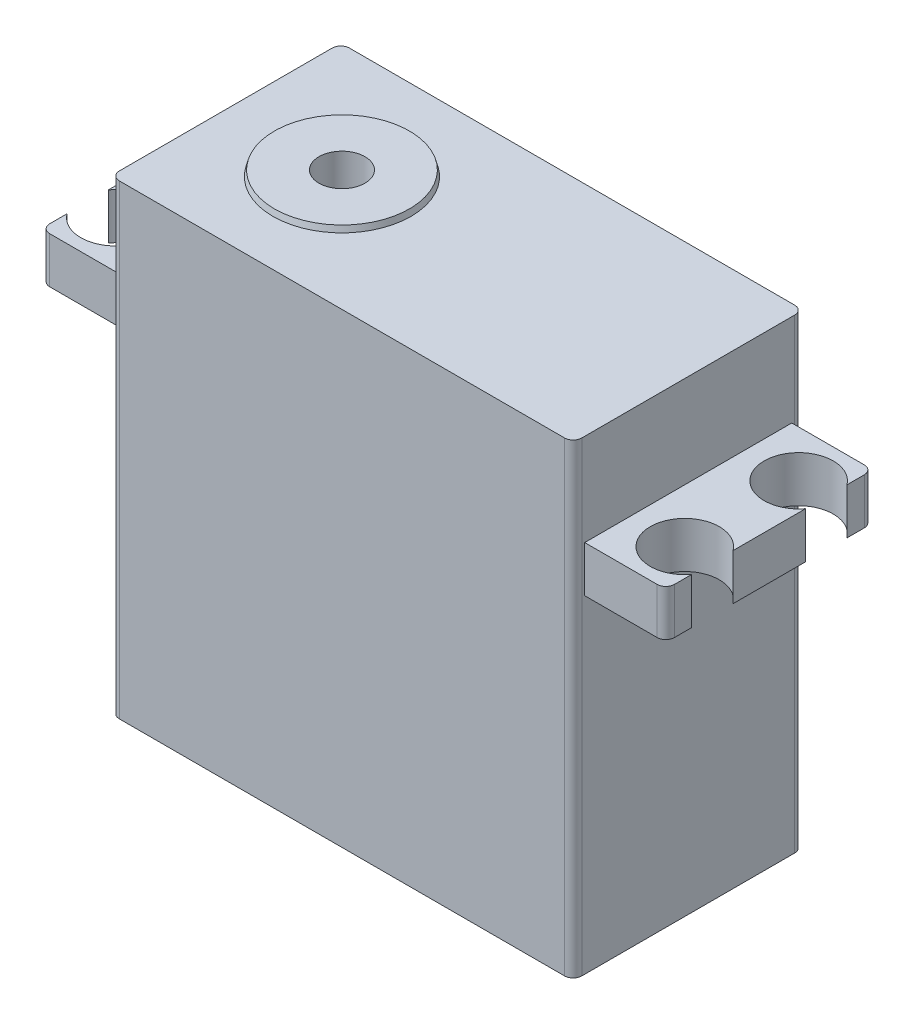
ISO-10303-21;
HEADER;
FILE_DESCRIPTION(('STEP AP214'),'2;1');
FILE_NAME('part.step','',(''),(''),'','','');
FILE_SCHEMA(('AUTOMOTIVE_DESIGN { 1 0 10303 214 1 1 1 1 }'));
ENDSEC;
DATA;
#1=APPLICATION_CONTEXT('core data for automotive mechanical design processes');
#2=APPLICATION_PROTOCOL_DEFINITION('international standard','automotive_design',2000,#1);
#3=PRODUCT_CONTEXT('',#1,'mechanical');
#4=PRODUCT('Part','Part','',(#3));
#5=PRODUCT_RELATED_PRODUCT_CATEGORY('part','',(#4));
#6=PRODUCT_DEFINITION_FORMATION('','',#4);
#7=PRODUCT_DEFINITION_CONTEXT('part definition',#1,'design');
#8=PRODUCT_DEFINITION('design','',#6,#7);
#9=PRODUCT_DEFINITION_SHAPE('','',#8);
#10=(LENGTH_UNIT() NAMED_UNIT(*) SI_UNIT(.MILLI.,.METRE.));
#11=(NAMED_UNIT(*) PLANE_ANGLE_UNIT() SI_UNIT($,.RADIAN.));
#12=(NAMED_UNIT(*) SI_UNIT($,.STERADIAN.) SOLID_ANGLE_UNIT());
#13=UNCERTAINTY_MEASURE_WITH_UNIT(LENGTH_MEASURE(1.E-05),#10,'distance_accuracy_value','');
#14=(GEOMETRIC_REPRESENTATION_CONTEXT(3) GLOBAL_UNCERTAINTY_ASSIGNED_CONTEXT((#13)) GLOBAL_UNIT_ASSIGNED_CONTEXT((#10,
#11,#12)) REPRESENTATION_CONTEXT('',''));
#15=CARTESIAN_POINT('',(0.,0.,0.));
#16=DIRECTION('',(0.,0.,1.));
#17=DIRECTION('',(1.,0.,0.));
#18=AXIS2_PLACEMENT_3D('',#15,#16,#17);
#19=CARTESIAN_POINT('',(-27.15,0.,0.));
#20=DIRECTION('',(1.,0.,0.));
#21=DIRECTION('',(0.,0.,1.));
#22=AXIS2_PLACEMENT_3D('',#19,#20,#21);
#23=PLANE('',#22);
#24=DIRECTION('',(0.,0.,-1.));
#25=VECTOR('',#24,1.);
#26=CARTESIAN_POINT('',(-27.15,32.5,9.));
#27=LINE('',#26,#25);
#28=CARTESIAN_POINT('',(-27.15,32.5,3.15));
#29=VERTEX_POINT('',#28);
#30=CARTESIAN_POINT('',(-27.15,32.5,-3.15));
#31=VERTEX_POINT('',#30);
#32=EDGE_CURVE('E254',#29,#31,#27,.T.);
#33=ORIENTED_EDGE('',*,*,#32,.T.);
#34=DIRECTION('',(0.,1.,0.));
#35=VECTOR('',#34,1.);
#36=CARTESIAN_POINT('',(-27.15,23.45,-3.15));
#37=LINE('',#36,#35);
#38=CARTESIAN_POINT('',(-27.15,28.5,-3.15));
#39=VERTEX_POINT('',#38);
#40=EDGE_CURVE('E239',#39,#31,#37,.T.);
#41=ORIENTED_EDGE('',*,*,#40,.F.);
#42=DIRECTION('',(0.,0.,-1.));
#43=VECTOR('',#42,1.);
#44=CARTESIAN_POINT('',(-27.15,28.5,9.));
#45=LINE('',#44,#43);
#46=CARTESIAN_POINT('',(-27.15,28.5,3.15));
#47=VERTEX_POINT('',#46);
#48=EDGE_CURVE('E290',#47,#39,#45,.T.);
#49=ORIENTED_EDGE('',*,*,#48,.F.);
#50=DIRECTION('',(0.,1.,0.));
#51=VECTOR('',#50,1.);
#52=CARTESIAN_POINT('',(-27.15,23.45,3.15));
#53=LINE('',#52,#51);
#54=EDGE_CURVE('E361',#29,#47,#53,.F.);
#55=ORIENTED_EDGE('',*,*,#54,.F.);
#56=EDGE_LOOP('',(#33,#41,#49,#55));
#57=FACE_BOUND('',#56,.T.);
#58=ADVANCED_FACE('F43',(#57),#23,.F.);
#59=CARTESIAN_POINT('',(-27.15,28.5,8.25));
#60=VERTEX_POINT('',#59);
#61=CARTESIAN_POINT('',(-27.15,28.5,6.75));
#62=VERTEX_POINT('',#61);
#63=EDGE_CURVE('E287',#60,#62,#45,.T.);
#64=ORIENTED_EDGE('',*,*,#63,.F.);
#65=DIRECTION('',(0.,-1.,0.));
#66=VECTOR('',#65,1.);
#67=CARTESIAN_POINT('',(-27.15,32.5,8.25));
#68=LINE('',#67,#66);
#69=CARTESIAN_POINT('',(-27.15,32.5,8.25));
#70=VERTEX_POINT('',#69);
#71=EDGE_CURVE('E409',#60,#70,#68,.F.);
#72=ORIENTED_EDGE('',*,*,#71,.T.);
#73=CARTESIAN_POINT('',(-27.15,32.5,6.75));
#74=VERTEX_POINT('',#73);
#75=EDGE_CURVE('E257',#70,#74,#27,.T.);
#76=ORIENTED_EDGE('',*,*,#75,.T.);
#77=DIRECTION('',(0.,1.,0.));
#78=VECTOR('',#77,1.);
#79=CARTESIAN_POINT('',(-27.15,23.45,6.75));
#80=LINE('',#79,#78);
#81=EDGE_CURVE('E359',#62,#74,#80,.T.);
#82=ORIENTED_EDGE('',*,*,#81,.F.);
#83=EDGE_LOOP('',(#64,#72,#76,#82));
#84=FACE_BOUND('',#83,.T.);
#85=ADVANCED_FACE('F529',(#84),#23,.F.);
#86=CARTESIAN_POINT('',(27.15,0.,0.));
#87=DIRECTION('',(-1.,0.,0.));
#88=DIRECTION('',(0.,0.,1.));
#89=AXIS2_PLACEMENT_3D('',#86,#87,#88);
#90=PLANE('',#89);
#91=DIRECTION('',(0.,0.,-1.));
#92=VECTOR('',#91,1.);
#93=CARTESIAN_POINT('',(27.15,28.5,9.));
#94=LINE('',#93,#92);
#95=CARTESIAN_POINT('',(27.15,28.5,-6.75));
#96=VERTEX_POINT('',#95);
#97=CARTESIAN_POINT('',(27.15,28.5,-8.25));
#98=VERTEX_POINT('',#97);
#99=EDGE_CURVE('E312',#96,#98,#94,.T.);
#100=ORIENTED_EDGE('',*,*,#99,.T.);
#101=DIRECTION('',(0.,1.,0.));
#102=VECTOR('',#101,1.);
#103=CARTESIAN_POINT('',(27.15,0.,-8.25));
#104=LINE('',#103,#102);
#105=CARTESIAN_POINT('',(27.15,32.5,-8.25));
#106=VERTEX_POINT('',#105);
#107=EDGE_CURVE('E421',#98,#106,#104,.T.);
#108=ORIENTED_EDGE('',*,*,#107,.T.);
#109=DIRECTION('',(0.,0.,-1.));
#110=VECTOR('',#109,1.);
#111=CARTESIAN_POINT('',(27.15,32.5,9.));
#112=LINE('',#111,#110);
#113=CARTESIAN_POINT('',(27.15,32.5,-6.75));
#114=VERTEX_POINT('',#113);
#115=EDGE_CURVE('E280',#114,#106,#112,.T.);
#116=ORIENTED_EDGE('',*,*,#115,.F.);
#117=DIRECTION('',(0.,1.,0.));
#118=VECTOR('',#117,1.);
#119=CARTESIAN_POINT('',(27.15,23.45,-6.75));
#120=LINE('',#119,#118);
#121=EDGE_CURVE('E354',#114,#96,#120,.F.);
#122=ORIENTED_EDGE('',*,*,#121,.T.);
#123=EDGE_LOOP('',(#100,#108,#116,#122));
#124=FACE_BOUND('',#123,.T.);
#125=ADVANCED_FACE('F463',(#124),#90,.F.);
#126=DIRECTION('',(0.,1.,0.));
#127=VECTOR('',#126,1.);
#128=CARTESIAN_POINT('',(27.15,23.45,-3.15));
#129=LINE('',#128,#127);
#130=CARTESIAN_POINT('',(27.15,28.5,-3.15));
#131=VERTEX_POINT('',#130);
#132=CARTESIAN_POINT('',(27.15,32.5,-3.15));
#133=VERTEX_POINT('',#132);
#134=EDGE_CURVE('E357',#131,#133,#129,.T.);
#135=ORIENTED_EDGE('',*,*,#134,.T.);
#136=CARTESIAN_POINT('',(27.15,32.5,3.15));
#137=VERTEX_POINT('',#136);
#138=EDGE_CURVE('E279',#137,#133,#112,.T.);
#139=ORIENTED_EDGE('',*,*,#138,.F.);
#140=DIRECTION('',(0.,1.,0.));
#141=VECTOR('',#140,1.);
#142=CARTESIAN_POINT('',(27.15,23.45,3.15));
#143=LINE('',#142,#141);
#144=CARTESIAN_POINT('',(27.15,28.5,3.15));
#145=VERTEX_POINT('',#144);
#146=EDGE_CURVE('E338',#137,#145,#143,.F.);
#147=ORIENTED_EDGE('',*,*,#146,.T.);
#148=EDGE_CURVE('E311',#145,#131,#94,.T.);
#149=ORIENTED_EDGE('',*,*,#148,.T.);
#150=EDGE_LOOP('',(#135,#139,#147,#149));
#151=FACE_BOUND('',#150,.T.);
#152=ADVANCED_FACE('F456',(#151),#90,.F.);
#153=CARTESIAN_POINT('',(27.15,32.5,8.25));
#154=VERTEX_POINT('',#153);
#155=CARTESIAN_POINT('',(27.15,32.5,6.75));
#156=VERTEX_POINT('',#155);
#157=EDGE_CURVE('E276',#154,#156,#112,.T.);
#158=ORIENTED_EDGE('',*,*,#157,.F.);
#159=DIRECTION('',(0.,-1.,0.));
#160=VECTOR('',#159,1.);
#161=CARTESIAN_POINT('',(27.15,0.,8.25));
#162=LINE('',#161,#160);
#163=CARTESIAN_POINT('',(27.15,28.5,8.25));
#164=VERTEX_POINT('',#163);
#165=EDGE_CURVE('E433',#154,#164,#162,.T.);
#166=ORIENTED_EDGE('',*,*,#165,.T.);
#167=CARTESIAN_POINT('',(27.15,28.5,6.75));
#168=VERTEX_POINT('',#167);
#169=EDGE_CURVE('E308',#164,#168,#94,.T.);
#170=ORIENTED_EDGE('',*,*,#169,.T.);
#171=DIRECTION('',(0.,1.,0.));
#172=VECTOR('',#171,1.);
#173=CARTESIAN_POINT('',(27.15,23.45,6.75));
#174=LINE('',#173,#172);
#175=EDGE_CURVE('E351',#168,#156,#174,.T.);
#176=ORIENTED_EDGE('',*,*,#175,.T.);
#177=EDGE_LOOP('',(#158,#166,#170,#176));
#178=FACE_BOUND('',#177,.T.);
#179=ADVANCED_FACE('F445',(#178),#90,.F.);
#180=CARTESIAN_POINT('',(-27.15,32.5,-6.75));
#181=VERTEX_POINT('',#180);
#182=CARTESIAN_POINT('',(-27.15,32.5,-8.25));
#183=VERTEX_POINT('',#182);
#184=EDGE_CURVE('E232',#181,#183,#27,.T.);
#185=ORIENTED_EDGE('',*,*,#184,.T.);
#186=DIRECTION('',(0.,1.,0.));
#187=VECTOR('',#186,1.);
#188=CARTESIAN_POINT('',(-27.15,28.5,-8.25));
#189=LINE('',#188,#187);
#190=CARTESIAN_POINT('',(-27.15,28.5,-8.25));
#191=VERTEX_POINT('',#190);
#192=EDGE_CURVE('E400',#183,#191,#189,.F.);
#193=ORIENTED_EDGE('',*,*,#192,.T.);
#194=CARTESIAN_POINT('',(-27.15,28.5,-6.75));
#195=VERTEX_POINT('',#194);
#196=EDGE_CURVE('E235',#195,#191,#45,.T.);
#197=ORIENTED_EDGE('',*,*,#196,.F.);
#198=DIRECTION('',(0.,1.,0.));
#199=VECTOR('',#198,1.);
#200=CARTESIAN_POINT('',(-27.15,23.45,-6.75));
#201=LINE('',#200,#199);
#202=EDGE_CURVE('E228',#181,#195,#201,.F.);
#203=ORIENTED_EDGE('',*,*,#202,.F.);
#204=EDGE_LOOP('',(#185,#193,#197,#203));
#205=FACE_BOUND('',#204,.T.);
#206=ADVANCED_FACE('F230',(#205),#23,.F.);
#207=CARTESIAN_POINT('',(-20.1,40.5,10.));
#208=DIRECTION('',(1.,0.,0.));
#209=DIRECTION('',(0.,0.,-1.));
#210=AXIS2_PLACEMENT_3D('',#207,#208,#209);
#211=PLANE('',#210);
#212=DIRECTION('',(0.,0.,1.));
#213=VECTOR('',#212,1.);
#214=CARTESIAN_POINT('',(-20.1,40.5,10.));
#215=LINE('',#214,#213);
#216=CARTESIAN_POINT('',(-20.1,40.5,-9.25));
#217=VERTEX_POINT('',#216);
#218=CARTESIAN_POINT('',(-20.1,40.5,9.25));
#219=VERTEX_POINT('',#218);
#220=EDGE_CURVE('E332',#217,#219,#215,.T.);
#221=ORIENTED_EDGE('',*,*,#220,.F.);
#222=DIRECTION('',(0.,-1.,0.));
#223=VECTOR('',#222,1.);
#224=CARTESIAN_POINT('',(-20.1,40.5,-9.25));
#225=LINE('',#224,#223);
#226=CARTESIAN_POINT('',(-20.1,0.,-9.25));
#227=VERTEX_POINT('',#226);
#228=EDGE_CURVE('E371',#217,#227,#225,.T.);
#229=ORIENTED_EDGE('',*,*,#228,.T.);
#230=DIRECTION('',(0.,0.,1.));
#231=VECTOR('',#230,1.);
#232=CARTESIAN_POINT('',(-20.1,0.,10.));
#233=LINE('',#232,#231);
#234=CARTESIAN_POINT('',(-20.1,0.,9.25));
#235=VERTEX_POINT('',#234);
#236=EDGE_CURVE('E344',#227,#235,#233,.T.);
#237=ORIENTED_EDGE('',*,*,#236,.T.);
#238=DIRECTION('',(0.,-1.,0.));
#239=VECTOR('',#238,1.);
#240=CARTESIAN_POINT('',(-20.1,40.5,9.25));
#241=LINE('',#240,#239);
#242=EDGE_CURVE('E369',#235,#219,#241,.F.);
#243=ORIENTED_EDGE('',*,*,#242,.T.);
#244=EDGE_LOOP('',(#221,#229,#237,#243));
#245=FACE_BOUND('',#244,.T.);
#246=DIRECTION('',(0.,0.,-1.));
#247=VECTOR('',#246,1.);
#248=CARTESIAN_POINT('',(-20.1,32.5,9.));
#249=LINE('',#248,#247);
#250=CARTESIAN_POINT('',(-20.1,32.5,9.));
#251=VERTEX_POINT('',#250);
#252=CARTESIAN_POINT('',(-20.1,32.5,-9.));
#253=VERTEX_POINT('',#252);
#254=EDGE_CURVE('E255',#251,#253,#249,.T.);
#255=ORIENTED_EDGE('',*,*,#254,.F.);
#256=DIRECTION('',(0.,-1.,0.));
#257=VECTOR('',#256,1.);
#258=CARTESIAN_POINT('',(-20.1,28.5,9.));
#259=LINE('',#258,#257);
#260=CARTESIAN_POINT('',(-20.1,28.5,9.));
#261=VERTEX_POINT('',#260);
#262=EDGE_CURVE('E286',#251,#261,#259,.T.);
#263=ORIENTED_EDGE('',*,*,#262,.T.);
#264=DIRECTION('',(0.,0.,-1.));
#265=VECTOR('',#264,1.);
#266=CARTESIAN_POINT('',(-20.1,28.5,9.));
#267=LINE('',#266,#265);
#268=CARTESIAN_POINT('',(-20.1,28.5,-8.99999999999999));
#269=VERTEX_POINT('',#268);
#270=EDGE_CURVE('E295',#261,#269,#267,.T.);
#271=ORIENTED_EDGE('',*,*,#270,.T.);
#272=DIRECTION('',(0.,1.,0.));
#273=VECTOR('',#272,1.);
#274=CARTESIAN_POINT('',(-20.1,28.5,-9.));
#275=LINE('',#274,#273);
#276=EDGE_CURVE('E293',#269,#253,#275,.T.);
#277=ORIENTED_EDGE('',*,*,#276,.T.);
#278=EDGE_LOOP('',(#255,#263,#271,#277));
#279=FACE_BOUND('',#278,.T.);
#280=ADVANCED_FACE('F479',(#245,#279),#211,.F.);
#281=CARTESIAN_POINT('',(20.1,40.5,10.));
#282=DIRECTION('',(-1.,0.,0.));
#283=DIRECTION('',(0.,0.,1.));
#284=AXIS2_PLACEMENT_3D('',#281,#282,#283);
#285=PLANE('',#284);
#286=DIRECTION('',(0.,-1.,0.));
#287=VECTOR('',#286,1.);
#288=CARTESIAN_POINT('',(20.1,28.5,9.));
#289=LINE('',#288,#287);
#290=CARTESIAN_POINT('',(20.1,32.5,9.));
#291=VERTEX_POINT('',#290);
#292=CARTESIAN_POINT('',(20.1,28.5,9.));
#293=VERTEX_POINT('',#292);
#294=EDGE_CURVE('E307',#291,#293,#289,.T.);
#295=ORIENTED_EDGE('',*,*,#294,.F.);
#296=DIRECTION('',(0.,0.,-1.));
#297=VECTOR('',#296,1.);
#298=CARTESIAN_POINT('',(20.1,32.5,9.));
#299=LINE('',#298,#297);
#300=CARTESIAN_POINT('',(20.1,32.5,-9.));
#301=VERTEX_POINT('',#300);
#302=EDGE_CURVE('E273',#291,#301,#299,.T.);
#303=ORIENTED_EDGE('',*,*,#302,.T.);
#304=DIRECTION('',(0.,1.,0.));
#305=VECTOR('',#304,1.);
#306=CARTESIAN_POINT('',(20.1,28.5,-9.));
#307=LINE('',#306,#305);
#308=CARTESIAN_POINT('',(20.1,28.5,-9.));
#309=VERTEX_POINT('',#308);
#310=EDGE_CURVE('E318',#309,#301,#307,.T.);
#311=ORIENTED_EDGE('',*,*,#310,.F.);
#312=DIRECTION('',(0.,0.,-1.));
#313=VECTOR('',#312,1.);
#314=CARTESIAN_POINT('',(20.1,28.5,9.));
#315=LINE('',#314,#313);
#316=EDGE_CURVE('E315',#293,#309,#315,.T.);
#317=ORIENTED_EDGE('',*,*,#316,.F.);
#318=EDGE_LOOP('',(#295,#303,#311,#317));
#319=FACE_BOUND('',#318,.T.);
#320=DIRECTION('',(0.,0.,-1.));
#321=VECTOR('',#320,1.);
#322=CARTESIAN_POINT('',(20.1,0.,10.));
#323=LINE('',#322,#321);
#324=CARTESIAN_POINT('',(20.1,0.,9.25));
#325=VERTEX_POINT('',#324);
#326=CARTESIAN_POINT('',(20.1,0.,-9.25));
#327=VERTEX_POINT('',#326);
#328=EDGE_CURVE('E324',#325,#327,#323,.T.);
#329=ORIENTED_EDGE('',*,*,#328,.T.);
#330=DIRECTION('',(0.,-1.,0.));
#331=VECTOR('',#330,1.);
#332=CARTESIAN_POINT('',(20.1,40.5,-9.25));
#333=LINE('',#332,#331);
#334=CARTESIAN_POINT('',(20.1,40.5,-9.25));
#335=VERTEX_POINT('',#334);
#336=EDGE_CURVE('E419',#327,#335,#333,.F.);
#337=ORIENTED_EDGE('',*,*,#336,.T.);
#338=DIRECTION('',(0.,0.,-1.));
#339=VECTOR('',#338,1.);
#340=CARTESIAN_POINT('',(20.1,40.5,10.));
#341=LINE('',#340,#339);
#342=CARTESIAN_POINT('',(20.1,40.5,9.25));
#343=VERTEX_POINT('',#342);
#344=EDGE_CURVE('E325',#343,#335,#341,.T.);
#345=ORIENTED_EDGE('',*,*,#344,.F.);
#346=DIRECTION('',(0.,-1.,0.));
#347=VECTOR('',#346,1.);
#348=CARTESIAN_POINT('',(20.1,40.5,9.25));
#349=LINE('',#348,#347);
#350=EDGE_CURVE('E416',#343,#325,#349,.T.);
#351=ORIENTED_EDGE('',*,*,#350,.T.);
#352=EDGE_LOOP('',(#329,#337,#345,#351));
#353=FACE_BOUND('',#352,.T.);
#354=ADVANCED_FACE('F475',(#319,#353),#285,.F.);
#355=CARTESIAN_POINT('',(-20.1,40.5,-10.));
#356=DIRECTION('',(0.,0.,1.));
#357=DIRECTION('',(1.,0.,0.));
#358=AXIS2_PLACEMENT_3D('',#355,#356,#357);
#359=PLANE('',#358);
#360=DIRECTION('',(-1.,0.,0.));
#361=VECTOR('',#360,1.);
#362=CARTESIAN_POINT('',(-20.1,0.,-10.));
#363=LINE('',#362,#361);
#364=CARTESIAN_POINT('',(19.35,0.,-10.));
#365=VERTEX_POINT('',#364);
#366=CARTESIAN_POINT('',(-19.35,0.,-10.));
#367=VERTEX_POINT('',#366);
#368=EDGE_CURVE('E341',#365,#367,#363,.T.);
#369=ORIENTED_EDGE('',*,*,#368,.T.);
#370=DIRECTION('',(0.,-1.,0.));
#371=VECTOR('',#370,1.);
#372=CARTESIAN_POINT('',(-19.35,40.5,-10.));
#373=LINE('',#372,#371);
#374=CARTESIAN_POINT('',(-19.35,40.5,-10.));
#375=VERTEX_POINT('',#374);
#376=EDGE_CURVE('E385',#367,#375,#373,.F.);
#377=ORIENTED_EDGE('',*,*,#376,.T.);
#378=DIRECTION('',(-1.,0.,0.));
#379=VECTOR('',#378,1.);
#380=CARTESIAN_POINT('',(-20.1,40.5,-10.));
#381=LINE('',#380,#379);
#382=CARTESIAN_POINT('',(19.35,40.5,-10.));
#383=VERTEX_POINT('',#382);
#384=EDGE_CURVE('E328',#383,#375,#381,.T.);
#385=ORIENTED_EDGE('',*,*,#384,.F.);
#386=DIRECTION('',(0.,-1.,0.));
#387=VECTOR('',#386,1.);
#388=CARTESIAN_POINT('',(19.35,40.5,-10.));
#389=LINE('',#388,#387);
#390=EDGE_CURVE('E382',#383,#365,#389,.T.);
#391=ORIENTED_EDGE('',*,*,#390,.T.);
#392=EDGE_LOOP('',(#369,#377,#385,#391));
#393=FACE_BOUND('',#392,.T.);
#394=ADVANCED_FACE('F478',(#393),#359,.F.);
#395=CARTESIAN_POINT('',(-20.1,40.5,10.));
#396=DIRECTION('',(0.,0.,-1.));
#397=DIRECTION('',(-1.,0.,0.));
#398=AXIS2_PLACEMENT_3D('',#395,#396,#397);
#399=PLANE('',#398);
#400=DIRECTION('',(1.,0.,0.));
#401=VECTOR('',#400,1.);
#402=CARTESIAN_POINT('',(-20.1,40.5,10.));
#403=LINE('',#402,#401);
#404=CARTESIAN_POINT('',(-19.35,40.5,10.));
#405=VERTEX_POINT('',#404);
#406=CARTESIAN_POINT('',(19.35,40.5,10.));
#407=VERTEX_POINT('',#406);
#408=EDGE_CURVE('E335',#405,#407,#403,.T.);
#409=ORIENTED_EDGE('',*,*,#408,.F.);
#410=DIRECTION('',(0.,-1.,0.));
#411=VECTOR('',#410,1.);
#412=CARTESIAN_POINT('',(-19.35,40.5,10.));
#413=LINE('',#412,#411);
#414=CARTESIAN_POINT('',(-19.35,0.,10.));
#415=VERTEX_POINT('',#414);
#416=EDGE_CURVE('E413',#405,#415,#413,.T.);
#417=ORIENTED_EDGE('',*,*,#416,.T.);
#418=DIRECTION('',(1.,0.,0.));
#419=VECTOR('',#418,1.);
#420=CARTESIAN_POINT('',(-20.1,0.,10.));
#421=LINE('',#420,#419);
#422=CARTESIAN_POINT('',(19.35,0.,10.));
#423=VERTEX_POINT('',#422);
#424=EDGE_CURVE('E329',#415,#423,#421,.T.);
#425=ORIENTED_EDGE('',*,*,#424,.T.);
#426=DIRECTION('',(0.,-1.,0.));
#427=VECTOR('',#426,1.);
#428=CARTESIAN_POINT('',(19.35,40.5,10.));
#429=LINE('',#428,#427);
#430=EDGE_CURVE('E411',#423,#407,#429,.F.);
#431=ORIENTED_EDGE('',*,*,#430,.T.);
#432=EDGE_LOOP('',(#409,#417,#425,#431));
#433=FACE_BOUND('',#432,.T.);
#434=ADVANCED_FACE('F512',(#433),#399,.F.);
#435=CARTESIAN_POINT('',(0.,40.5,0.));
#436=DIRECTION('',(0.,-1.,0.));
#437=DIRECTION('',(0.,0.,-1.));
#438=AXIS2_PLACEMENT_3D('',#435,#436,#437);
#439=PLANE('',#438);
#440=CARTESIAN_POINT('',(-10.,40.5,0.));
#441=DIRECTION('',(0.,-1.,0.));
#442=DIRECTION('',(0.,0.,-1.));
#443=AXIS2_PLACEMENT_3D('',#440,#441,#442);
#444=CIRCLE('',#443,6.);
#445=CARTESIAN_POINT('',(-10.,40.5,-6.));
#446=VERTEX_POINT('',#445);
#447=EDGE_CURVE('E11',#446,#446,#444,.F.);
#448=ORIENTED_EDGE('',*,*,#447,.F.);
#449=EDGE_LOOP('',(#448));
#450=FACE_BOUND('',#449,.T.);
#451=ORIENTED_EDGE('',*,*,#384,.T.);
#452=CARTESIAN_POINT('',(-19.35,40.5,-9.25));
#453=DIRECTION('',(0.,-1.,0.));
#454=DIRECTION('',(0.,0.,-1.));
#455=AXIS2_PLACEMENT_3D('',#452,#453,#454);
#456=CIRCLE('',#455,0.75);
#457=EDGE_CURVE('E393',#375,#217,#456,.F.);
#458=ORIENTED_EDGE('',*,*,#457,.T.);
#459=ORIENTED_EDGE('',*,*,#220,.T.);
#460=CARTESIAN_POINT('',(-19.35,40.5,9.25));
#461=DIRECTION('',(0.,-1.,0.));
#462=DIRECTION('',(0.,0.,-1.));
#463=AXIS2_PLACEMENT_3D('',#460,#461,#462);
#464=CIRCLE('',#463,0.75);
#465=EDGE_CURVE('E391',#219,#405,#464,.F.);
#466=ORIENTED_EDGE('',*,*,#465,.T.);
#467=ORIENTED_EDGE('',*,*,#408,.T.);
#468=CARTESIAN_POINT('',(19.35,40.5,9.25));
#469=DIRECTION('',(0.,-1.,0.));
#470=DIRECTION('',(0.,0.,-1.));
#471=AXIS2_PLACEMENT_3D('',#468,#469,#470);
#472=CIRCLE('',#471,0.75);
#473=EDGE_CURVE('E387',#407,#343,#472,.F.);
#474=ORIENTED_EDGE('',*,*,#473,.T.);
#475=ORIENTED_EDGE('',*,*,#344,.T.);
#476=CARTESIAN_POINT('',(19.35,40.5,-9.25));
#477=DIRECTION('',(0.,-1.,0.));
#478=DIRECTION('',(0.,0.,-1.));
#479=AXIS2_PLACEMENT_3D('',#476,#477,#478);
#480=CIRCLE('',#479,0.75);
#481=EDGE_CURVE('E389',#335,#383,#480,.F.);
#482=ORIENTED_EDGE('',*,*,#481,.T.);
#483=EDGE_LOOP('',(#451,#458,#459,#466,#467,#474,#475,#482));
#484=FACE_BOUND('',#483,.T.);
#485=ADVANCED_FACE('F492',(#450,#484),#439,.F.);
#486=CARTESIAN_POINT('',(0.,0.,0.));
#487=DIRECTION('',(0.,-1.,0.));
#488=DIRECTION('',(0.,0.,-1.));
#489=AXIS2_PLACEMENT_3D('',#486,#487,#488);
#490=PLANE('',#489);
#491=ORIENTED_EDGE('',*,*,#236,.F.);
#492=CARTESIAN_POINT('',(-19.35,0.,-9.25));
#493=DIRECTION('',(0.,-1.,0.));
#494=DIRECTION('',(0.,0.,-1.));
#495=AXIS2_PLACEMENT_3D('',#492,#493,#494);
#496=CIRCLE('',#495,0.75);
#497=EDGE_CURVE('E380',#227,#367,#496,.T.);
#498=ORIENTED_EDGE('',*,*,#497,.T.);
#499=ORIENTED_EDGE('',*,*,#368,.F.);
#500=CARTESIAN_POINT('',(19.35,0.,-9.25));
#501=DIRECTION('',(0.,-1.,0.));
#502=DIRECTION('',(0.,0.,-1.));
#503=AXIS2_PLACEMENT_3D('',#500,#501,#502);
#504=CIRCLE('',#503,0.75);
#505=EDGE_CURVE('E376',#365,#327,#504,.T.);
#506=ORIENTED_EDGE('',*,*,#505,.T.);
#507=ORIENTED_EDGE('',*,*,#328,.F.);
#508=CARTESIAN_POINT('',(19.35,0.,9.25));
#509=DIRECTION('',(0.,-1.,0.));
#510=DIRECTION('',(0.,0.,-1.));
#511=AXIS2_PLACEMENT_3D('',#508,#509,#510);
#512=CIRCLE('',#511,0.75);
#513=EDGE_CURVE('E374',#325,#423,#512,.T.);
#514=ORIENTED_EDGE('',*,*,#513,.T.);
#515=ORIENTED_EDGE('',*,*,#424,.F.);
#516=CARTESIAN_POINT('',(-19.35,0.,9.25));
#517=DIRECTION('',(0.,-1.,0.));
#518=DIRECTION('',(0.,0.,-1.));
#519=AXIS2_PLACEMENT_3D('',#516,#517,#518);
#520=CIRCLE('',#519,0.75);
#521=EDGE_CURVE('E378',#415,#235,#520,.T.);
#522=ORIENTED_EDGE('',*,*,#521,.T.);
#523=EDGE_LOOP('',(#491,#498,#499,#506,#507,#514,#515,#522));
#524=FACE_BOUND('',#523,.T.);
#525=ADVANCED_FACE('F517',(#524),#490,.T.);
#526=CARTESIAN_POINT('',(27.15,28.5,9.));
#527=DIRECTION('',(0.,0.,-1.));
#528=DIRECTION('',(-1.,0.,0.));
#529=AXIS2_PLACEMENT_3D('',#526,#527,#528);
#530=PLANE('',#529);
#531=DIRECTION('',(-1.,0.,0.));
#532=VECTOR('',#531,1.);
#533=CARTESIAN_POINT('',(27.15,28.5,9.));
#534=LINE('',#533,#532);
#535=CARTESIAN_POINT('',(26.4,28.5,9.));
#536=VERTEX_POINT('',#535);
#537=EDGE_CURVE('E322',#536,#293,#534,.T.);
#538=ORIENTED_EDGE('',*,*,#537,.F.);
#539=DIRECTION('',(0.,-1.,0.));
#540=VECTOR('',#539,1.);
#541=CARTESIAN_POINT('',(26.4,28.5,9.));
#542=LINE('',#541,#540);
#543=CARTESIAN_POINT('',(26.4,32.5,9.));
#544=VERTEX_POINT('',#543);
#545=EDGE_CURVE('E51',#536,#544,#542,.F.);
#546=ORIENTED_EDGE('',*,*,#545,.T.);
#547=DIRECTION('',(-1.,0.,0.));
#548=VECTOR('',#547,1.);
#549=CARTESIAN_POINT('',(27.15,32.5,9.));
#550=LINE('',#549,#548);
#551=EDGE_CURVE('E278',#544,#291,#550,.T.);
#552=ORIENTED_EDGE('',*,*,#551,.T.);
#553=ORIENTED_EDGE('',*,*,#294,.T.);
#554=EDGE_LOOP('',(#538,#546,#552,#553));
#555=FACE_BOUND('',#554,.T.);
#556=ADVANCED_FACE('F436',(#555),#530,.F.);
#557=CARTESIAN_POINT('',(27.15,28.5,9.));
#558=DIRECTION('',(0.,1.,0.));
#559=DIRECTION('',(0.,0.,1.));
#560=AXIS2_PLACEMENT_3D('',#557,#558,#559);
#561=PLANE('',#560);
#562=DIRECTION('',(-1.,0.,0.));
#563=VECTOR('',#562,1.);
#564=CARTESIAN_POINT('',(27.15,28.5,-9.));
#565=LINE('',#564,#563);
#566=CARTESIAN_POINT('',(26.4,28.5,-9.));
#567=VERTEX_POINT('',#566);
#568=EDGE_CURVE('E310',#567,#309,#565,.T.);
#569=ORIENTED_EDGE('',*,*,#568,.F.);
#570=CARTESIAN_POINT('',(26.4,28.5,-8.25));
#571=DIRECTION('',(0.,1.,0.));
#572=DIRECTION('',(0.,0.,1.));
#573=AXIS2_PLACEMENT_3D('',#570,#571,#572);
#574=CIRCLE('',#573,0.75);
#575=EDGE_CURVE('E431',#567,#98,#574,.F.);
#576=ORIENTED_EDGE('',*,*,#575,.T.);
#577=ORIENTED_EDGE('',*,*,#99,.F.);
#578=CARTESIAN_POINT('',(24.75,28.5,-4.95));
#579=DIRECTION('',(0.,1.,0.));
#580=DIRECTION('',(0.,0.,1.));
#581=AXIS2_PLACEMENT_3D('',#578,#579,#580);
#582=CIRCLE('',#581,3.);
#583=EDGE_CURVE('E304',#96,#131,#582,.T.);
#584=ORIENTED_EDGE('',*,*,#583,.T.);
#585=ORIENTED_EDGE('',*,*,#148,.F.);
#586=CARTESIAN_POINT('',(24.75,28.5,4.95));
#587=DIRECTION('',(0.,1.,0.));
#588=DIRECTION('',(0.,0.,1.));
#589=AXIS2_PLACEMENT_3D('',#586,#587,#588);
#590=CIRCLE('',#589,3.);
#591=EDGE_CURVE('E301',#145,#168,#590,.T.);
#592=ORIENTED_EDGE('',*,*,#591,.T.);
#593=ORIENTED_EDGE('',*,*,#169,.F.);
#594=CARTESIAN_POINT('',(26.4,28.5,8.25));
#595=DIRECTION('',(0.,1.,0.));
#596=DIRECTION('',(0.,0.,1.));
#597=AXIS2_PLACEMENT_3D('',#594,#595,#596);
#598=CIRCLE('',#597,0.75);
#599=EDGE_CURVE('E58',#164,#536,#598,.F.);
#600=ORIENTED_EDGE('',*,*,#599,.T.);
#601=ORIENTED_EDGE('',*,*,#537,.T.);
#602=ORIENTED_EDGE('',*,*,#316,.T.);
#603=EDGE_LOOP('',(#569,#576,#577,#584,#585,#592,#593,#600,#601,#602));
#604=FACE_BOUND('',#603,.T.);
#605=ADVANCED_FACE('F448',(#604),#561,.F.);
#606=CARTESIAN_POINT('',(27.15,28.5,-9.));
#607=DIRECTION('',(0.,0.,1.));
#608=DIRECTION('',(1.,0.,0.));
#609=AXIS2_PLACEMENT_3D('',#606,#607,#608);
#610=PLANE('',#609);
#611=DIRECTION('',(-1.,0.,0.));
#612=VECTOR('',#611,1.);
#613=CARTESIAN_POINT('',(27.15,32.5,-9.));
#614=LINE('',#613,#612);
#615=CARTESIAN_POINT('',(26.4,32.5,-9.));
#616=VERTEX_POINT('',#615);
#617=EDGE_CURVE('E284',#616,#301,#614,.T.);
#618=ORIENTED_EDGE('',*,*,#617,.F.);
#619=DIRECTION('',(0.,1.,0.));
#620=VECTOR('',#619,1.);
#621=CARTESIAN_POINT('',(26.4,28.5,-9.));
#622=LINE('',#621,#620);
#623=EDGE_CURVE('E428',#616,#567,#622,.F.);
#624=ORIENTED_EDGE('',*,*,#623,.T.);
#625=ORIENTED_EDGE('',*,*,#568,.T.);
#626=ORIENTED_EDGE('',*,*,#310,.T.);
#627=EDGE_LOOP('',(#618,#624,#625,#626));
#628=FACE_BOUND('',#627,.T.);
#629=ADVANCED_FACE('F471',(#628),#610,.F.);
#630=CARTESIAN_POINT('',(24.75,23.45,4.95));
#631=DIRECTION('',(0.,1.,0.));
#632=DIRECTION('',(0.,0.,1.));
#633=AXIS2_PLACEMENT_3D('',#630,#631,#632);
#634=CYLINDRICAL_SURFACE('',#633,3.);
#635=ORIENTED_EDGE('',*,*,#591,.F.);
#636=ORIENTED_EDGE('',*,*,#146,.F.);
#637=CARTESIAN_POINT('',(24.75,32.5,4.95));
#638=DIRECTION('',(0.,1.,0.));
#639=DIRECTION('',(0.,0.,1.));
#640=AXIS2_PLACEMENT_3D('',#637,#638,#639);
#641=CIRCLE('',#640,3.);
#642=EDGE_CURVE('E238',#156,#137,#641,.F.);
#643=ORIENTED_EDGE('',*,*,#642,.F.);
#644=ORIENTED_EDGE('',*,*,#175,.F.);
#645=EDGE_LOOP('',(#635,#636,#643,#644));
#646=FACE_BOUND('',#645,.T.);
#647=ADVANCED_FACE('F452',(#646),#634,.F.);
#648=CARTESIAN_POINT('',(24.75,23.45,-4.95));
#649=DIRECTION('',(0.,1.,0.));
#650=DIRECTION('',(0.,0.,1.));
#651=AXIS2_PLACEMENT_3D('',#648,#649,#650);
#652=CYLINDRICAL_SURFACE('',#651,3.);
#653=ORIENTED_EDGE('',*,*,#583,.F.);
#654=ORIENTED_EDGE('',*,*,#121,.F.);
#655=CARTESIAN_POINT('',(24.75,32.5,-4.95));
#656=DIRECTION('',(0.,1.,0.));
#657=DIRECTION('',(0.,0.,1.));
#658=AXIS2_PLACEMENT_3D('',#655,#656,#657);
#659=CIRCLE('',#658,3.);
#660=EDGE_CURVE('E366',#133,#114,#659,.F.);
#661=ORIENTED_EDGE('',*,*,#660,.F.);
#662=ORIENTED_EDGE('',*,*,#134,.F.);
#663=EDGE_LOOP('',(#653,#654,#661,#662));
#664=FACE_BOUND('',#663,.T.);
#665=ADVANCED_FACE('F571',(#664),#652,.F.);
#666=CARTESIAN_POINT('',(-27.15,28.5,9.));
#667=DIRECTION('',(0.,0.,1.));
#668=DIRECTION('',(1.,0.,0.));
#669=AXIS2_PLACEMENT_3D('',#666,#667,#668);
#670=PLANE('',#669);
#671=DIRECTION('',(1.,0.,0.));
#672=VECTOR('',#671,1.);
#673=CARTESIAN_POINT('',(-27.15,32.5,9.));
#674=LINE('',#673,#672);
#675=CARTESIAN_POINT('',(-26.4,32.5,9.));
#676=VERTEX_POINT('',#675);
#677=EDGE_CURVE('E267',#676,#251,#674,.T.);
#678=ORIENTED_EDGE('',*,*,#677,.F.);
#679=DIRECTION('',(0.,-1.,0.));
#680=VECTOR('',#679,1.);
#681=CARTESIAN_POINT('',(-26.4,28.5,9.));
#682=LINE('',#681,#680);
#683=CARTESIAN_POINT('',(-26.4,28.5,9.));
#684=VERTEX_POINT('',#683);
#685=EDGE_CURVE('E406',#676,#684,#682,.T.);
#686=ORIENTED_EDGE('',*,*,#685,.T.);
#687=DIRECTION('',(1.,0.,0.));
#688=VECTOR('',#687,1.);
#689=CARTESIAN_POINT('',(-27.15,28.5,9.));
#690=LINE('',#689,#688);
#691=EDGE_CURVE('E289',#684,#261,#690,.T.);
#692=ORIENTED_EDGE('',*,*,#691,.T.);
#693=ORIENTED_EDGE('',*,*,#262,.F.);
#694=EDGE_LOOP('',(#678,#686,#692,#693));
#695=FACE_BOUND('',#694,.T.);
#696=ADVANCED_FACE('F581',(#695),#670,.T.);
#697=CARTESIAN_POINT('',(-27.15,28.5,-9.));
#698=DIRECTION('',(0.,0.,-1.));
#699=DIRECTION('',(-1.,0.,0.));
#700=AXIS2_PLACEMENT_3D('',#697,#698,#699);
#701=PLANE('',#700);
#702=DIRECTION('',(1.,0.,0.));
#703=VECTOR('',#702,1.);
#704=CARTESIAN_POINT('',(-27.15,28.5,-9.));
#705=LINE('',#704,#703);
#706=CARTESIAN_POINT('',(-26.4,28.5,-9.));
#707=VERTEX_POINT('',#706);
#708=EDGE_CURVE('E299',#707,#269,#705,.T.);
#709=ORIENTED_EDGE('',*,*,#708,.F.);
#710=DIRECTION('',(0.,1.,0.));
#711=VECTOR('',#710,1.);
#712=CARTESIAN_POINT('',(-26.4,32.5,-9.));
#713=LINE('',#712,#711);
#714=CARTESIAN_POINT('',(-26.4,32.5,-9.));
#715=VERTEX_POINT('',#714);
#716=EDGE_CURVE('E395',#707,#715,#713,.T.);
#717=ORIENTED_EDGE('',*,*,#716,.T.);
#718=DIRECTION('',(1.,0.,0.));
#719=VECTOR('',#718,1.);
#720=CARTESIAN_POINT('',(-27.15,32.5,-9.));
#721=LINE('',#720,#719);
#722=EDGE_CURVE('E262',#715,#253,#721,.T.);
#723=ORIENTED_EDGE('',*,*,#722,.T.);
#724=ORIENTED_EDGE('',*,*,#276,.F.);
#725=EDGE_LOOP('',(#709,#717,#723,#724));
#726=FACE_BOUND('',#725,.T.);
#727=ADVANCED_FACE('F740',(#726),#701,.T.);
#728=CARTESIAN_POINT('',(-27.15,28.5,9.));
#729=DIRECTION('',(0.,-1.,0.));
#730=DIRECTION('',(0.,0.,-1.));
#731=AXIS2_PLACEMENT_3D('',#728,#729,#730);
#732=PLANE('',#731);
#733=ORIENTED_EDGE('',*,*,#196,.T.);
#734=CARTESIAN_POINT('',(-26.4,28.5,-8.25));
#735=DIRECTION('',(0.,-1.,0.));
#736=DIRECTION('',(0.,0.,-1.));
#737=AXIS2_PLACEMENT_3D('',#734,#735,#736);
#738=CIRCLE('',#737,0.75);
#739=EDGE_CURVE('E404',#191,#707,#738,.T.);
#740=ORIENTED_EDGE('',*,*,#739,.T.);
#741=ORIENTED_EDGE('',*,*,#708,.T.);
#742=ORIENTED_EDGE('',*,*,#270,.F.);
#743=ORIENTED_EDGE('',*,*,#691,.F.);
#744=CARTESIAN_POINT('',(-26.4,28.5,8.25));
#745=DIRECTION('',(0.,-1.,0.));
#746=DIRECTION('',(0.,0.,-1.));
#747=AXIS2_PLACEMENT_3D('',#744,#745,#746);
#748=CIRCLE('',#747,0.75);
#749=EDGE_CURVE('E402',#684,#60,#748,.T.);
#750=ORIENTED_EDGE('',*,*,#749,.T.);
#751=ORIENTED_EDGE('',*,*,#63,.T.);
#752=CARTESIAN_POINT('',(-24.75,28.5,4.95));
#753=DIRECTION('',(0.,-1.,0.));
#754=DIRECTION('',(0.,0.,-1.));
#755=AXIS2_PLACEMENT_3D('',#752,#753,#754);
#756=CIRCLE('',#755,3.);
#757=EDGE_CURVE('E763',#62,#47,#756,.F.);
#758=ORIENTED_EDGE('',*,*,#757,.T.);
#759=ORIENTED_EDGE('',*,*,#48,.T.);
#760=CARTESIAN_POINT('',(-24.75,28.5,-4.95));
#761=DIRECTION('',(0.,-1.,0.));
#762=DIRECTION('',(0.,0.,-1.));
#763=AXIS2_PLACEMENT_3D('',#760,#761,#762);
#764=CIRCLE('',#763,3.);
#765=EDGE_CURVE('E259',#39,#195,#764,.F.);
#766=ORIENTED_EDGE('',*,*,#765,.T.);
#767=EDGE_LOOP('',(#733,#740,#741,#742,#743,#750,#751,#758,#759,#766));
#768=FACE_BOUND('',#767,.T.);
#769=ADVANCED_FACE('F736',(#768),#732,.T.);
#770=CARTESIAN_POINT('',(27.15,32.5,9.));
#771=DIRECTION('',(0.,1.,0.));
#772=DIRECTION('',(0.,0.,1.));
#773=AXIS2_PLACEMENT_3D('',#770,#771,#772);
#774=PLANE('',#773);
#775=ORIENTED_EDGE('',*,*,#115,.T.);
#776=CARTESIAN_POINT('',(26.4,32.5,-8.25));
#777=DIRECTION('',(0.,1.,0.));
#778=DIRECTION('',(0.,0.,1.));
#779=AXIS2_PLACEMENT_3D('',#776,#777,#778);
#780=CIRCLE('',#779,0.75);
#781=EDGE_CURVE('E426',#106,#616,#780,.T.);
#782=ORIENTED_EDGE('',*,*,#781,.T.);
#783=ORIENTED_EDGE('',*,*,#617,.T.);
#784=ORIENTED_EDGE('',*,*,#302,.F.);
#785=ORIENTED_EDGE('',*,*,#551,.F.);
#786=CARTESIAN_POINT('',(26.4,32.5,8.25));
#787=DIRECTION('',(0.,1.,0.));
#788=DIRECTION('',(0.,0.,1.));
#789=AXIS2_PLACEMENT_3D('',#786,#787,#788);
#790=CIRCLE('',#789,0.75);
#791=EDGE_CURVE('E424',#544,#154,#790,.T.);
#792=ORIENTED_EDGE('',*,*,#791,.T.);
#793=ORIENTED_EDGE('',*,*,#157,.T.);
#794=ORIENTED_EDGE('',*,*,#642,.T.);
#795=ORIENTED_EDGE('',*,*,#138,.T.);
#796=ORIENTED_EDGE('',*,*,#660,.T.);
#797=EDGE_LOOP('',(#775,#782,#783,#784,#785,#792,#793,#794,#795,#796));
#798=FACE_BOUND('',#797,.T.);
#799=ADVANCED_FACE('F442',(#798),#774,.T.);
#800=CARTESIAN_POINT('',(-27.15,32.5,9.));
#801=DIRECTION('',(0.,-1.,0.));
#802=DIRECTION('',(0.,0.,-1.));
#803=AXIS2_PLACEMENT_3D('',#800,#801,#802);
#804=PLANE('',#803);
#805=ORIENTED_EDGE('',*,*,#722,.F.);
#806=CARTESIAN_POINT('',(-26.4,32.5,-8.25));
#807=DIRECTION('',(0.,-1.,0.));
#808=DIRECTION('',(0.,0.,-1.));
#809=AXIS2_PLACEMENT_3D('',#806,#807,#808);
#810=CIRCLE('',#809,0.75);
#811=EDGE_CURVE('E253',#715,#183,#810,.F.);
#812=ORIENTED_EDGE('',*,*,#811,.T.);
#813=ORIENTED_EDGE('',*,*,#184,.F.);
#814=CARTESIAN_POINT('',(-24.75,32.5,-4.95));
#815=DIRECTION('',(0.,-1.,0.));
#816=DIRECTION('',(0.,0.,-1.));
#817=AXIS2_PLACEMENT_3D('',#814,#815,#816);
#818=CIRCLE('',#817,3.);
#819=EDGE_CURVE('E242',#181,#31,#818,.T.);
#820=ORIENTED_EDGE('',*,*,#819,.T.);
#821=ORIENTED_EDGE('',*,*,#32,.F.);
#822=CARTESIAN_POINT('',(-24.75,32.5,4.95));
#823=DIRECTION('',(0.,-1.,0.));
#824=DIRECTION('',(0.,0.,-1.));
#825=AXIS2_PLACEMENT_3D('',#822,#823,#824);
#826=CIRCLE('',#825,3.);
#827=EDGE_CURVE('E248',#29,#74,#826,.T.);
#828=ORIENTED_EDGE('',*,*,#827,.T.);
#829=ORIENTED_EDGE('',*,*,#75,.F.);
#830=CARTESIAN_POINT('',(-26.4,32.5,8.25));
#831=DIRECTION('',(0.,-1.,0.));
#832=DIRECTION('',(0.,0.,-1.));
#833=AXIS2_PLACEMENT_3D('',#830,#831,#832);
#834=CIRCLE('',#833,0.75);
#835=EDGE_CURVE('E397',#70,#676,#834,.F.);
#836=ORIENTED_EDGE('',*,*,#835,.T.);
#837=ORIENTED_EDGE('',*,*,#677,.T.);
#838=ORIENTED_EDGE('',*,*,#254,.T.);
#839=EDGE_LOOP('',(#805,#812,#813,#820,#821,#828,#829,#836,#837,#838));
#840=FACE_BOUND('',#839,.T.);
#841=ADVANCED_FACE('F252',(#840),#804,.F.);
#842=CARTESIAN_POINT('',(-24.75,23.45,4.95));
#843=DIRECTION('',(0.,1.,0.));
#844=DIRECTION('',(0.,0.,1.));
#845=AXIS2_PLACEMENT_3D('',#842,#843,#844);
#846=CYLINDRICAL_SURFACE('',#845,3.);
#847=ORIENTED_EDGE('',*,*,#54,.T.);
#848=ORIENTED_EDGE('',*,*,#757,.F.);
#849=ORIENTED_EDGE('',*,*,#81,.T.);
#850=ORIENTED_EDGE('',*,*,#827,.F.);
#851=EDGE_LOOP('',(#847,#848,#849,#850));
#852=FACE_BOUND('',#851,.T.);
#853=ADVANCED_FACE('F590',(#852),#846,.F.);
#854=CARTESIAN_POINT('',(-24.75,23.45,-4.95));
#855=DIRECTION('',(0.,1.,0.));
#856=DIRECTION('',(0.,0.,1.));
#857=AXIS2_PLACEMENT_3D('',#854,#855,#856);
#858=CYLINDRICAL_SURFACE('',#857,3.);
#859=ORIENTED_EDGE('',*,*,#202,.T.);
#860=ORIENTED_EDGE('',*,*,#765,.F.);
#861=ORIENTED_EDGE('',*,*,#40,.T.);
#862=ORIENTED_EDGE('',*,*,#819,.F.);
#863=EDGE_LOOP('',(#859,#860,#861,#862));
#864=FACE_BOUND('',#863,.T.);
#865=ADVANCED_FACE('F243',(#864),#858,.F.);
#866=CARTESIAN_POINT('',(-19.35,40.5,-9.25));
#867=DIRECTION('',(0.,-1.,0.));
#868=DIRECTION('',(0.,0.,-1.));
#869=AXIS2_PLACEMENT_3D('',#866,#867,#868);
#870=CYLINDRICAL_SURFACE('',#869,0.75);
#871=ORIENTED_EDGE('',*,*,#457,.F.);
#872=ORIENTED_EDGE('',*,*,#376,.F.);
#873=ORIENTED_EDGE('',*,*,#497,.F.);
#874=ORIENTED_EDGE('',*,*,#228,.F.);
#875=EDGE_LOOP('',(#871,#872,#873,#874));
#876=FACE_BOUND('',#875,.T.);
#877=ADVANCED_FACE('F498',(#876),#870,.T.);
#878=CARTESIAN_POINT('',(-26.4,28.5,-8.25));
#879=DIRECTION('',(0.,-1.,0.));
#880=DIRECTION('',(0.,0.,-1.));
#881=AXIS2_PLACEMENT_3D('',#878,#879,#880);
#882=CYLINDRICAL_SURFACE('',#881,0.75);
#883=ORIENTED_EDGE('',*,*,#739,.F.);
#884=ORIENTED_EDGE('',*,*,#192,.F.);
#885=ORIENTED_EDGE('',*,*,#811,.F.);
#886=ORIENTED_EDGE('',*,*,#716,.F.);
#887=EDGE_LOOP('',(#883,#884,#885,#886));
#888=FACE_BOUND('',#887,.T.);
#889=ADVANCED_FACE('F630',(#888),#882,.T.);
#890=CARTESIAN_POINT('',(-26.4,28.5,8.25));
#891=DIRECTION('',(0.,1.,0.));
#892=DIRECTION('',(0.,0.,1.));
#893=AXIS2_PLACEMENT_3D('',#890,#891,#892);
#894=CYLINDRICAL_SURFACE('',#893,0.75);
#895=ORIENTED_EDGE('',*,*,#835,.F.);
#896=ORIENTED_EDGE('',*,*,#71,.F.);
#897=ORIENTED_EDGE('',*,*,#749,.F.);
#898=ORIENTED_EDGE('',*,*,#685,.F.);
#899=EDGE_LOOP('',(#895,#896,#897,#898));
#900=FACE_BOUND('',#899,.T.);
#901=ADVANCED_FACE('F637',(#900),#894,.T.);
#902=CARTESIAN_POINT('',(-19.35,40.5,9.25));
#903=DIRECTION('',(0.,-1.,0.));
#904=DIRECTION('',(0.,0.,-1.));
#905=AXIS2_PLACEMENT_3D('',#902,#903,#904);
#906=CYLINDRICAL_SURFACE('',#905,0.75);
#907=ORIENTED_EDGE('',*,*,#465,.F.);
#908=ORIENTED_EDGE('',*,*,#242,.F.);
#909=ORIENTED_EDGE('',*,*,#521,.F.);
#910=ORIENTED_EDGE('',*,*,#416,.F.);
#911=EDGE_LOOP('',(#907,#908,#909,#910));
#912=FACE_BOUND('',#911,.T.);
#913=ADVANCED_FACE('F507',(#912),#906,.T.);
#914=CARTESIAN_POINT('',(19.35,40.5,-9.25));
#915=DIRECTION('',(0.,-1.,0.));
#916=DIRECTION('',(0.,0.,-1.));
#917=AXIS2_PLACEMENT_3D('',#914,#915,#916);
#918=CYLINDRICAL_SURFACE('',#917,0.75);
#919=ORIENTED_EDGE('',*,*,#481,.F.);
#920=ORIENTED_EDGE('',*,*,#336,.F.);
#921=ORIENTED_EDGE('',*,*,#505,.F.);
#922=ORIENTED_EDGE('',*,*,#390,.F.);
#923=EDGE_LOOP('',(#919,#920,#921,#922));
#924=FACE_BOUND('',#923,.T.);
#925=ADVANCED_FACE('F488',(#924),#918,.T.);
#926=CARTESIAN_POINT('',(19.35,40.5,9.25));
#927=DIRECTION('',(0.,-1.,0.));
#928=DIRECTION('',(0.,0.,-1.));
#929=AXIS2_PLACEMENT_3D('',#926,#927,#928);
#930=CYLINDRICAL_SURFACE('',#929,0.75);
#931=ORIENTED_EDGE('',*,*,#473,.F.);
#932=ORIENTED_EDGE('',*,*,#430,.F.);
#933=ORIENTED_EDGE('',*,*,#513,.F.);
#934=ORIENTED_EDGE('',*,*,#350,.F.);
#935=EDGE_LOOP('',(#931,#932,#933,#934));
#936=FACE_BOUND('',#935,.T.);
#937=ADVANCED_FACE('F516',(#936),#930,.T.);
#938=CARTESIAN_POINT('',(26.4,0.,-8.25));
#939=DIRECTION('',(0.,1.,0.));
#940=DIRECTION('',(0.,0.,1.));
#941=AXIS2_PLACEMENT_3D('',#938,#939,#940);
#942=CYLINDRICAL_SURFACE('',#941,0.75);
#943=ORIENTED_EDGE('',*,*,#575,.F.);
#944=ORIENTED_EDGE('',*,*,#623,.F.);
#945=ORIENTED_EDGE('',*,*,#781,.F.);
#946=ORIENTED_EDGE('',*,*,#107,.F.);
#947=EDGE_LOOP('',(#943,#944,#945,#946));
#948=FACE_BOUND('',#947,.T.);
#949=ADVANCED_FACE('F468',(#948),#942,.T.);
#950=CARTESIAN_POINT('',(26.4,0.,8.25));
#951=DIRECTION('',(0.,-1.,0.));
#952=DIRECTION('',(0.,0.,-1.));
#953=AXIS2_PLACEMENT_3D('',#950,#951,#952);
#954=CYLINDRICAL_SURFACE('',#953,0.75);
#955=ORIENTED_EDGE('',*,*,#791,.F.);
#956=ORIENTED_EDGE('',*,*,#545,.F.);
#957=ORIENTED_EDGE('',*,*,#599,.F.);
#958=ORIENTED_EDGE('',*,*,#165,.F.);
#959=EDGE_LOOP('',(#955,#956,#957,#958));
#960=FACE_BOUND('',#959,.T.);
#961=ADVANCED_FACE('F45',(#960),#954,.T.);
#962=CARTESIAN_POINT('',(-10.,40.5,0.));
#963=DIRECTION('',(0.,-1.,0.));
#964=DIRECTION('',(0.,0.,1.));
#965=AXIS2_PLACEMENT_3D('',#962,#963,#964);
#966=CONICAL_SURFACE('',#965,6.,0.261799387799149);
#967=CARTESIAN_POINT('',(-10.,41.,0.));
#968=DIRECTION('',(0.,1.,0.));
#969=DIRECTION('',(0.,0.,1.));
#970=AXIS2_PLACEMENT_3D('',#967,#968,#969);
#971=CIRCLE('',#970,5.86602540378444);
#972=CARTESIAN_POINT('',(-10.,41.,5.86602540378444));
#973=VERTEX_POINT('',#972);
#974=EDGE_CURVE('E249',#973,#973,#971,.T.);
#975=ORIENTED_EDGE('',*,*,#974,.F.);
#976=EDGE_LOOP('',(#975));
#977=FACE_BOUND('',#976,.T.);
#978=ORIENTED_EDGE('',*,*,#447,.T.);
#979=EDGE_LOOP('',(#978));
#980=FACE_BOUND('',#979,.T.);
#981=ADVANCED_FACE('F675',(#977,#980),#966,.T.);
#982=CARTESIAN_POINT('',(-10.,41.,0.));
#983=DIRECTION('',(0.,1.,0.));
#984=DIRECTION('',(0.,0.,1.));
#985=AXIS2_PLACEMENT_3D('',#982,#983,#984);
#986=PLANE('',#985);
#987=CARTESIAN_POINT('',(-10.,41.,0.));
#988=DIRECTION('',(0.,1.,0.));
#989=DIRECTION('',(0.,0.,1.));
#990=AXIS2_PLACEMENT_3D('',#987,#988,#989);
#991=CIRCLE('',#990,2.);
#992=CARTESIAN_POINT('',(-10.,41.,2.));
#993=VERTEX_POINT('',#992);
#994=EDGE_CURVE('E775',#993,#993,#991,.T.);
#995=ORIENTED_EDGE('',*,*,#994,.F.);
#996=EDGE_LOOP('',(#995));
#997=FACE_BOUND('',#996,.T.);
#998=ORIENTED_EDGE('',*,*,#974,.T.);
#999=EDGE_LOOP('',(#998));
#1000=FACE_BOUND('',#999,.T.);
#1001=ADVANCED_FACE('F682',(#997,#1000),#986,.T.);
#1002=CARTESIAN_POINT('',(-10.,36.,0.));
#1003=DIRECTION('',(0.,1.,0.));
#1004=DIRECTION('',(0.,0.,1.));
#1005=AXIS2_PLACEMENT_3D('',#1002,#1003,#1004);
#1006=CYLINDRICAL_SURFACE('',#1005,2.);
#1007=CARTESIAN_POINT('',(-10.,36.,0.));
#1008=DIRECTION('',(0.,1.,0.));
#1009=DIRECTION('',(0.,0.,1.));
#1010=AXIS2_PLACEMENT_3D('',#1007,#1008,#1009);
#1011=CIRCLE('',#1010,2.);
#1012=CARTESIAN_POINT('',(-10.,36.,2.));
#1013=VERTEX_POINT('',#1012);
#1014=EDGE_CURVE('E774',#1013,#1013,#1011,.T.);
#1015=ORIENTED_EDGE('',*,*,#1014,.F.);
#1016=EDGE_LOOP('',(#1015));
#1017=FACE_BOUND('',#1016,.T.);
#1018=ORIENTED_EDGE('',*,*,#994,.T.);
#1019=EDGE_LOOP('',(#1018));
#1020=FACE_BOUND('',#1019,.T.);
#1021=ADVANCED_FACE('F690',(#1017,#1020),#1006,.F.);
#1022=CARTESIAN_POINT('',(-10.,36.,0.));
#1023=DIRECTION('',(0.,1.,0.));
#1024=DIRECTION('',(0.,0.,1.));
#1025=AXIS2_PLACEMENT_3D('',#1022,#1023,#1024);
#1026=PLANE('',#1025);
#1027=ORIENTED_EDGE('',*,*,#1014,.T.);
#1028=EDGE_LOOP('',(#1027));
#1029=FACE_BOUND('',#1028,.T.);
#1030=ADVANCED_FACE('F698',(#1029),#1026,.T.);
#1031=CLOSED_SHELL('',(#58,#85,#125,#152,#179,#206,#280,#354,#394,#434,#485,#525,#556,#605,#629,
#647,#665,#696,#727,#769,#799,#841,#853,#865,#877,#889,#901,#913,#925,#937,#949,#961,#981,#1001,
#1021,#1030));
#1032=MANIFOLD_SOLID_BREP('B2',#1031);
#1033=ADVANCED_BREP_SHAPE_REPRESENTATION('',(#18,#1032),#14);
#1034=SHAPE_DEFINITION_REPRESENTATION(#9,#1033);
ENDSEC;
END-ISO-10303-21;
